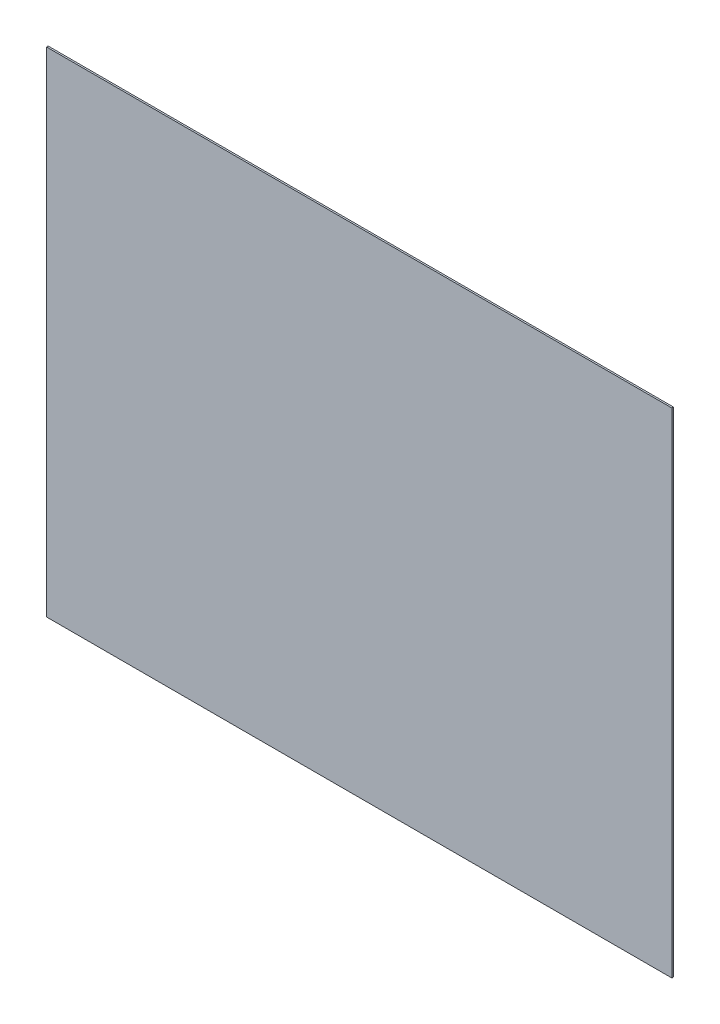
ISO-10303-21;
HEADER;
FILE_DESCRIPTION(('STEP AP214'),'2;1');
FILE_NAME('part.step','',(''),(''),'','','');
FILE_SCHEMA(('AUTOMOTIVE_DESIGN { 1 0 10303 214 1 1 1 1 }'));
ENDSEC;
DATA;
#1=APPLICATION_CONTEXT('core data for automotive mechanical design processes');
#2=APPLICATION_PROTOCOL_DEFINITION('international standard','automotive_design',2000,#1);
#3=PRODUCT_CONTEXT('',#1,'mechanical');
#4=PRODUCT('Part','Part','',(#3));
#5=PRODUCT_RELATED_PRODUCT_CATEGORY('part','',(#4));
#6=PRODUCT_DEFINITION_FORMATION('','',#4);
#7=PRODUCT_DEFINITION_CONTEXT('part definition',#1,'design');
#8=PRODUCT_DEFINITION('design','',#6,#7);
#9=PRODUCT_DEFINITION_SHAPE('','',#8);
#10=(LENGTH_UNIT() NAMED_UNIT(*) SI_UNIT(.MILLI.,.METRE.));
#11=(NAMED_UNIT(*) PLANE_ANGLE_UNIT() SI_UNIT($,.RADIAN.));
#12=(NAMED_UNIT(*) SI_UNIT($,.STERADIAN.) SOLID_ANGLE_UNIT());
#13=UNCERTAINTY_MEASURE_WITH_UNIT(LENGTH_MEASURE(1.E-05),#10,'distance_accuracy_value','');
#14=(GEOMETRIC_REPRESENTATION_CONTEXT(3) GLOBAL_UNCERTAINTY_ASSIGNED_CONTEXT((#13)) GLOBAL_UNIT_ASSIGNED_CONTEXT((#10,
#11,#12)) REPRESENTATION_CONTEXT('',''));
#15=CARTESIAN_POINT('',(0.,0.,0.));
#16=DIRECTION('',(0.,0.,1.));
#17=DIRECTION('',(1.,0.,0.));
#18=AXIS2_PLACEMENT_3D('',#15,#16,#17);
#19=CARTESIAN_POINT('',(-190.,-150.,1.));
#20=DIRECTION('',(1.,0.,0.));
#21=DIRECTION('',(0.,0.,-1.));
#22=AXIS2_PLACEMENT_3D('',#19,#20,#21);
#23=PLANE('',#22);
#24=DIRECTION('',(0.,-1.,0.));
#25=VECTOR('',#24,1.);
#26=CARTESIAN_POINT('',(-190.,-150.,0.));
#27=LINE('',#26,#25);
#28=CARTESIAN_POINT('',(-190.,150.,0.));
#29=VERTEX_POINT('',#28);
#30=CARTESIAN_POINT('',(-190.,-150.,0.));
#31=VERTEX_POINT('',#30);
#32=EDGE_CURVE('E97',#29,#31,#27,.T.);
#33=ORIENTED_EDGE('',*,*,#32,.T.);
#34=DIRECTION('',(0.,0.,-1.));
#35=VECTOR('',#34,1.);
#36=CARTESIAN_POINT('',(-190.,-150.,1.));
#37=LINE('',#36,#35);
#38=CARTESIAN_POINT('',(-190.,-150.,1.));
#39=VERTEX_POINT('',#38);
#40=EDGE_CURVE('E11',#39,#31,#37,.T.);
#41=ORIENTED_EDGE('',*,*,#40,.F.);
#42=DIRECTION('',(0.,-1.,0.));
#43=VECTOR('',#42,1.);
#44=CARTESIAN_POINT('',(-190.,-150.,1.));
#45=LINE('',#44,#43);
#46=CARTESIAN_POINT('',(-190.,150.,1.));
#47=VERTEX_POINT('',#46);
#48=EDGE_CURVE('E85',#47,#39,#45,.T.);
#49=ORIENTED_EDGE('',*,*,#48,.F.);
#50=DIRECTION('',(0.,0.,-1.));
#51=VECTOR('',#50,1.);
#52=CARTESIAN_POINT('',(-190.,150.,1.));
#53=LINE('',#52,#51);
#54=EDGE_CURVE('E93',#47,#29,#53,.T.);
#55=ORIENTED_EDGE('',*,*,#54,.T.);
#56=EDGE_LOOP('',(#33,#41,#49,#55));
#57=FACE_BOUND('',#56,.T.);
#58=ADVANCED_FACE('F34',(#57),#23,.F.);
#59=CARTESIAN_POINT('',(190.,-150.,1.));
#60=DIRECTION('',(0.,1.,0.));
#61=DIRECTION('',(-1.,0.,0.));
#62=AXIS2_PLACEMENT_3D('',#59,#60,#61);
#63=PLANE('',#62);
#64=DIRECTION('',(1.,0.,0.));
#65=VECTOR('',#64,1.);
#66=CARTESIAN_POINT('',(190.,-150.,0.));
#67=LINE('',#66,#65);
#68=CARTESIAN_POINT('',(190.,-150.,0.));
#69=VERTEX_POINT('',#68);
#70=EDGE_CURVE('E89',#31,#69,#67,.T.);
#71=ORIENTED_EDGE('',*,*,#70,.T.);
#72=DIRECTION('',(0.,0.,-1.));
#73=VECTOR('',#72,1.);
#74=CARTESIAN_POINT('',(190.,-150.,1.));
#75=LINE('',#74,#73);
#76=CARTESIAN_POINT('',(190.,-150.,1.));
#77=VERTEX_POINT('',#76);
#78=EDGE_CURVE('E42',#77,#69,#75,.T.);
#79=ORIENTED_EDGE('',*,*,#78,.F.);
#80=DIRECTION('',(1.,0.,0.));
#81=VECTOR('',#80,1.);
#82=CARTESIAN_POINT('',(190.,-150.,1.));
#83=LINE('',#82,#81);
#84=EDGE_CURVE('E80',#39,#77,#83,.T.);
#85=ORIENTED_EDGE('',*,*,#84,.F.);
#86=ORIENTED_EDGE('',*,*,#40,.T.);
#87=EDGE_LOOP('',(#71,#79,#85,#86));
#88=FACE_BOUND('',#87,.T.);
#89=ADVANCED_FACE('F88',(#88),#63,.F.);
#90=CARTESIAN_POINT('',(190.,-150.,1.));
#91=DIRECTION('',(-1.,0.,0.));
#92=DIRECTION('',(0.,0.,1.));
#93=AXIS2_PLACEMENT_3D('',#90,#91,#92);
#94=PLANE('',#93);
#95=DIRECTION('',(0.,1.,0.));
#96=VECTOR('',#95,1.);
#97=CARTESIAN_POINT('',(190.,-150.,0.));
#98=LINE('',#97,#96);
#99=CARTESIAN_POINT('',(190.,150.,0.));
#100=VERTEX_POINT('',#99);
#101=EDGE_CURVE('E67',#69,#100,#98,.T.);
#102=ORIENTED_EDGE('',*,*,#101,.T.);
#103=DIRECTION('',(0.,0.,-1.));
#104=VECTOR('',#103,1.);
#105=CARTESIAN_POINT('',(190.,150.,1.));
#106=LINE('',#105,#104);
#107=CARTESIAN_POINT('',(190.,150.,1.));
#108=VERTEX_POINT('',#107);
#109=EDGE_CURVE('E90',#108,#100,#106,.T.);
#110=ORIENTED_EDGE('',*,*,#109,.F.);
#111=DIRECTION('',(0.,1.,0.));
#112=VECTOR('',#111,1.);
#113=CARTESIAN_POINT('',(190.,-150.,1.));
#114=LINE('',#113,#112);
#115=EDGE_CURVE('E83',#77,#108,#114,.T.);
#116=ORIENTED_EDGE('',*,*,#115,.F.);
#117=ORIENTED_EDGE('',*,*,#78,.T.);
#118=EDGE_LOOP('',(#102,#110,#116,#117));
#119=FACE_BOUND('',#118,.T.);
#120=ADVANCED_FACE('F91',(#119),#94,.F.);
#121=CARTESIAN_POINT('',(190.,150.,1.));
#122=DIRECTION('',(0.,-1.,0.));
#123=DIRECTION('',(1.,0.,0.));
#124=AXIS2_PLACEMENT_3D('',#121,#122,#123);
#125=PLANE('',#124);
#126=DIRECTION('',(-1.,0.,0.));
#127=VECTOR('',#126,1.);
#128=CARTESIAN_POINT('',(190.,150.,0.));
#129=LINE('',#128,#127);
#130=EDGE_CURVE('E73',#100,#29,#129,.T.);
#131=ORIENTED_EDGE('',*,*,#130,.T.);
#132=ORIENTED_EDGE('',*,*,#54,.F.);
#133=DIRECTION('',(-1.,0.,0.));
#134=VECTOR('',#133,1.);
#135=CARTESIAN_POINT('',(190.,150.,1.));
#136=LINE('',#135,#134);
#137=EDGE_CURVE('E50',#108,#47,#136,.T.);
#138=ORIENTED_EDGE('',*,*,#137,.F.);
#139=ORIENTED_EDGE('',*,*,#109,.T.);
#140=EDGE_LOOP('',(#131,#132,#138,#139));
#141=FACE_BOUND('',#140,.T.);
#142=ADVANCED_FACE('F104',(#141),#125,.F.);
#143=CARTESIAN_POINT('',(0.,0.,1.));
#144=DIRECTION('',(0.,0.,1.));
#145=DIRECTION('',(1.,0.,0.));
#146=AXIS2_PLACEMENT_3D('',#143,#144,#145);
#147=PLANE('',#146);
#148=ORIENTED_EDGE('',*,*,#48,.T.);
#149=ORIENTED_EDGE('',*,*,#84,.T.);
#150=ORIENTED_EDGE('',*,*,#115,.T.);
#151=ORIENTED_EDGE('',*,*,#137,.T.);
#152=EDGE_LOOP('',(#148,#149,#150,#151));
#153=FACE_BOUND('',#152,.T.);
#154=ADVANCED_FACE('F81',(#153),#147,.T.);
#155=CARTESIAN_POINT('',(0.,0.,0.));
#156=DIRECTION('',(0.,0.,1.));
#157=DIRECTION('',(1.,0.,0.));
#158=AXIS2_PLACEMENT_3D('',#155,#156,#157);
#159=PLANE('',#158);
#160=ORIENTED_EDGE('',*,*,#32,.F.);
#161=ORIENTED_EDGE('',*,*,#130,.F.);
#162=ORIENTED_EDGE('',*,*,#101,.F.);
#163=ORIENTED_EDGE('',*,*,#70,.F.);
#164=EDGE_LOOP('',(#160,#161,#162,#163));
#165=FACE_BOUND('',#164,.T.);
#166=ADVANCED_FACE('F107',(#165),#159,.F.);
#167=CLOSED_SHELL('',(#58,#89,#120,#142,#154,#166));
#168=MANIFOLD_SOLID_BREP('B2',#167);
#169=ADVANCED_BREP_SHAPE_REPRESENTATION('',(#18,#168),#14);
#170=SHAPE_DEFINITION_REPRESENTATION(#9,#169);
ENDSEC;
END-ISO-10303-21;
